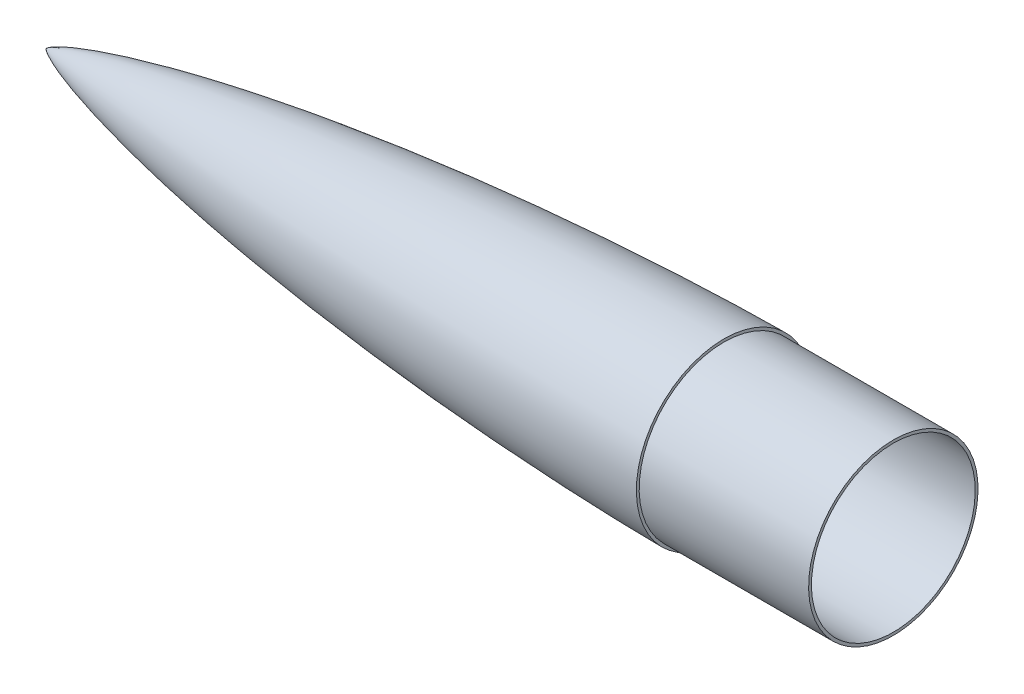
ISO-10303-21;
HEADER;
FILE_DESCRIPTION(('STEP AP214'),'2;1');
FILE_NAME('part.step','',(''),(''),'','','');
FILE_SCHEMA(('AUTOMOTIVE_DESIGN { 1 0 10303 214 1 1 1 1 }'));
ENDSEC;
DATA;
#1=APPLICATION_CONTEXT('core data for automotive mechanical design processes');
#2=APPLICATION_PROTOCOL_DEFINITION('international standard','automotive_design',2000,#1);
#3=PRODUCT_CONTEXT('',#1,'mechanical');
#4=PRODUCT('Part','Part','',(#3));
#5=PRODUCT_RELATED_PRODUCT_CATEGORY('part','',(#4));
#6=PRODUCT_DEFINITION_FORMATION('','',#4);
#7=PRODUCT_DEFINITION_CONTEXT('part definition',#1,'design');
#8=PRODUCT_DEFINITION('design','',#6,#7);
#9=PRODUCT_DEFINITION_SHAPE('','',#8);
#10=(LENGTH_UNIT() NAMED_UNIT(*) SI_UNIT(.MILLI.,.METRE.));
#11=(NAMED_UNIT(*) PLANE_ANGLE_UNIT() SI_UNIT($,.RADIAN.));
#12=(NAMED_UNIT(*) SI_UNIT($,.STERADIAN.) SOLID_ANGLE_UNIT());
#13=UNCERTAINTY_MEASURE_WITH_UNIT(LENGTH_MEASURE(1.E-05),#10,'distance_accuracy_value','');
#14=(GEOMETRIC_REPRESENTATION_CONTEXT(3) GLOBAL_UNCERTAINTY_ASSIGNED_CONTEXT((#13)) GLOBAL_UNIT_ASSIGNED_CONTEXT((#10,
#11,#12)) REPRESENTATION_CONTEXT('',''));
#15=CARTESIAN_POINT('',(0.,0.,0.));
#16=DIRECTION('',(0.,0.,1.));
#17=DIRECTION('',(1.,0.,0.));
#18=AXIS2_PLACEMENT_3D('',#15,#16,#17);
#19=CARTESIAN_POINT('',(600.,77.47,0.));
#20=CARTESIAN_POINT('',(597.65942685615,77.4658447079853,0.));
#21=CARTESIAN_POINT('',(592.978363359539,77.4343815130163,0.));
#22=CARTESIAN_POINT('',(583.616580802426,77.3332270163609,0.));
#23=CARTESIAN_POINT('',(569.49898193955,77.0956420813191,0.));
#24=CARTESIAN_POINT('',(552.966974814571,76.7206442390957,0.));
#25=CARTESIAN_POINT('',(529.266767625619,76.0339427982279,0.));
#26=CARTESIAN_POINT('',(500.742476414387,74.9827203862761,0.));
#27=CARTESIAN_POINT('',(467.476897077385,73.4429334180026,0.));
#28=CARTESIAN_POINT('',(429.481236677833,71.2563574350326,0.));
#29=CARTESIAN_POINT('',(391.513008679083,68.6356349821623,0.));
#30=CARTESIAN_POINT('',(353.578315332802,65.5666018523048,0.));
#31=CARTESIAN_POINT('',(315.684360024788,62.0288790639346,0.));
#32=CARTESIAN_POINT('',(277.839844478135,57.9951587186892,0.));
#33=CARTESIAN_POINT('',(240.055676063664,53.429010597853,0.));
#34=CARTESIAN_POINT('',(202.346019248344,48.2813417831547,0.));
#35=CARTESIAN_POINT('',(164.730421005852,42.4831314182115,0.));
#36=CARTESIAN_POINT('',(127.23756562155,35.932970079367,0.));
#37=CARTESIAN_POINT('',(92.1582043708413,28.9162848658495,0.));
#38=CARTESIAN_POINT('',(62.1009311464059,21.963904539052,0.));
#39=CARTESIAN_POINT('',(38.7361525078949,15.6535896542926,0.));
#40=CARTESIAN_POINT('',(23.0835174284881,10.7181703875056,0.));
#41=CARTESIAN_POINT('',(13.5227181713681,7.2185674366616,0.));
#42=CARTESIAN_POINT('',(7.85416793843196,4.81697869824112,0.));
#43=CARTESIAN_POINT('',(4.58865834047113,3.22196644659707,0.));
#44=CARTESIAN_POINT('',(2.74783568717532,2.19293433235411,0.));
#45=CARTESIAN_POINT('',(1.69521024540144,1.52603190181352,0.));
#46=CARTESIAN_POINT('',(1.1051925874636,1.10516765352529,0.));
#47=CARTESIAN_POINT('',(0.771381240188915,0.842123474085589,0.));
#48=CARTESIAN_POINT('',(0.567424397047217,0.667916865151608,0.));
#49=CARTESIAN_POINT('',(0.43490723908524,0.54786201784897,0.));
#50=CARTESIAN_POINT('',(0.31923409863706,0.43507249409992,0.));
#51=CARTESIAN_POINT('',(0.220339344368632,0.329970565301287,0.));
#52=CARTESIAN_POINT('',(0.138303003683084,0.233353669249751,0.));
#53=CARTESIAN_POINT('',(0.0807145741040968,0.157043573133438,0.));
#54=CARTESIAN_POINT('',(0.0401094622425092,0.0938383592977765,0.));
#55=CARTESIAN_POINT('',(0.0148611351607867,0.0453295476488326,0.));
#56=CARTESIAN_POINT('',(0.00482787870715673,0.0199168479065363,0.));
#57=CARTESIAN_POINT('',(0.00136820872431822,0.00671705417682318,0.));
#58=CARTESIAN_POINT('',(0.,0.,0.));
#59=B_SPLINE_CURVE_WITH_KNOTS('',4,(#19,#20,#21,#22,#23,#24,#25,#26,#27,#28,#29,#30,#31,#32,#33,
#34,#35,#36,#37,#38,#39,#40,#41,#42,#43,#44,#45,#46,#47,#48,#49,#50,#51,#52,#53,#54,#55,#56,#57,
#58),.UNSPECIFIED.,.F.,.F.,(5,1,1,1,1,1,1,1,1,1,1,1,1,1,1,1,1,1,1,1,1,1,1,1,1,1,1,1,1,1,1,1,1,1,
1,1,5),(0.,0.0153997937640812,0.0307995875281624,0.0615991750563248,0.0928992558619234,
0.124199336667522,0.186799498458059,0.249399660860594,0.311999822513962,0.37459998350091,
0.437200146859816,0.499800306621234,0.562400471363379,0.625000629652062,0.687600789677371,
0.750200949634411,0.812801112197428,0.87540126127302,0.9229481068622,0.953144474697247,
0.971996436080039,0.983353241385931,0.989910737043794,0.993632388483547,0.995896449383874,
0.997222203333055,0.998105498098468,0.998398642474987,0.998691786851506,0.998986789101797,
0.999281791352087,0.999461343514065,0.999640895676044,0.999820447838022,0.999910223919011,
0.999955111959505,1.),.UNSPECIFIED.);
#60=CARTESIAN_POINT('',(2700.,0.,0.));
#61=DIRECTION('',(1.,0.,0.));
#62=AXIS1_PLACEMENT('',#60,#61);
#63=SURFACE_OF_REVOLUTION('',#59,#62);
#64=CARTESIAN_POINT('',(0.,0.,0.));
#65=VERTEX_POINT('',#64);
#66=VERTEX_LOOP('',#65);
#67=FACE_BOUND('',#66,.T.);
#68=CARTESIAN_POINT('',(600.,0.,0.));
#69=DIRECTION('',(1.,0.,0.));
#70=DIRECTION('',(0.,1.,0.));
#71=AXIS2_PLACEMENT_3D('',#68,#69,#70);
#72=CIRCLE('',#71,77.47);
#73=CARTESIAN_POINT('',(600.,77.47,0.));
#74=VERTEX_POINT('',#73);
#75=EDGE_CURVE('E42',#74,#74,#72,.T.);
#76=ORIENTED_EDGE('',*,*,#75,.F.);
#77=EDGE_LOOP('',(#76));
#78=FACE_BOUND('',#77,.T.);
#79=ADVANCED_FACE('F35',(#67,#78),#63,.F.);
#80=CARTESIAN_POINT('',(600.,77.47,0.));
#81=DIRECTION('',(1.,0.,0.));
#82=DIRECTION('',(0.,1.,0.));
#83=AXIS2_PLACEMENT_3D('',#80,#81,#82);
#84=PLANE('',#83);
#85=CARTESIAN_POINT('',(600.,0.,0.));
#86=DIRECTION('',(1.,0.,0.));
#87=DIRECTION('',(0.,1.,0.));
#88=AXIS2_PLACEMENT_3D('',#85,#86,#87);
#89=CIRCLE('',#88,75.);
#90=CARTESIAN_POINT('',(600.,75.,0.));
#91=VERTEX_POINT('',#90);
#92=EDGE_CURVE('E53',#91,#91,#89,.T.);
#93=ORIENTED_EDGE('',*,*,#92,.F.);
#94=EDGE_LOOP('',(#93));
#95=FACE_BOUND('',#94,.T.);
#96=ORIENTED_EDGE('',*,*,#75,.T.);
#97=EDGE_LOOP('',(#96));
#98=FACE_BOUND('',#97,.T.);
#99=ADVANCED_FACE('F47',(#95,#98),#84,.T.);
#100=CARTESIAN_POINT('',(750.,0.,0.));
#101=DIRECTION('',(1.,0.,0.));
#102=DIRECTION('',(0.,1.,0.));
#103=AXIS2_PLACEMENT_3D('',#100,#101,#102);
#104=PLANE('',#103);
#105=CARTESIAN_POINT('',(750.,0.,0.));
#106=DIRECTION('',(1.,0.,0.));
#107=DIRECTION('',(0.,1.,0.));
#108=AXIS2_PLACEMENT_3D('',#105,#106,#107);
#109=CIRCLE('',#108,75.);
#110=CARTESIAN_POINT('',(750.,75.,0.));
#111=VERTEX_POINT('',#110);
#112=EDGE_CURVE('E51',#111,#111,#109,.T.);
#113=ORIENTED_EDGE('',*,*,#112,.T.);
#114=EDGE_LOOP('',(#113));
#115=FACE_BOUND('',#114,.T.);
#116=CARTESIAN_POINT('',(750.,0.,0.));
#117=DIRECTION('',(1.,0.,0.));
#118=DIRECTION('',(0.,1.,0.));
#119=AXIS2_PLACEMENT_3D('',#116,#117,#118);
#120=CIRCLE('',#119,72.5);
#121=CARTESIAN_POINT('',(750.,72.5,0.));
#122=VERTEX_POINT('',#121);
#123=EDGE_CURVE('E63',#122,#122,#120,.T.);
#124=ORIENTED_EDGE('',*,*,#123,.F.);
#125=EDGE_LOOP('',(#124));
#126=FACE_BOUND('',#125,.T.);
#127=ADVANCED_FACE('F71',(#115,#126),#104,.T.);
#128=CARTESIAN_POINT('',(750.,0.,0.));
#129=DIRECTION('',(-1.,0.,0.));
#130=DIRECTION('',(0.,-1.,0.));
#131=AXIS2_PLACEMENT_3D('',#128,#129,#130);
#132=CYLINDRICAL_SURFACE('',#131,75.);
#133=ORIENTED_EDGE('',*,*,#112,.F.);
#134=EDGE_LOOP('',(#133));
#135=FACE_BOUND('',#134,.T.);
#136=ORIENTED_EDGE('',*,*,#92,.T.);
#137=EDGE_LOOP('',(#136));
#138=FACE_BOUND('',#137,.T.);
#139=ADVANCED_FACE('F73',(#135,#138),#132,.T.);
#140=CARTESIAN_POINT('',(750.,0.,0.));
#141=DIRECTION('',(-1.,0.,0.));
#142=DIRECTION('',(0.,-1.,0.));
#143=AXIS2_PLACEMENT_3D('',#140,#141,#142);
#144=CYLINDRICAL_SURFACE('',#143,72.5);
#145=ORIENTED_EDGE('',*,*,#123,.T.);
#146=EDGE_LOOP('',(#145));
#147=FACE_BOUND('',#146,.T.);
#148=CARTESIAN_POINT('',(600.,0.,0.));
#149=DIRECTION('',(1.,0.,0.));
#150=DIRECTION('',(0.,1.,0.));
#151=AXIS2_PLACEMENT_3D('',#148,#149,#150);
#152=CIRCLE('',#151,72.5);
#153=CARTESIAN_POINT('',(600.,72.5,0.));
#154=VERTEX_POINT('',#153);
#155=EDGE_CURVE('E11',#154,#154,#152,.F.);
#156=ORIENTED_EDGE('',*,*,#155,.T.);
#157=EDGE_LOOP('',(#156));
#158=FACE_BOUND('',#157,.T.);
#159=ADVANCED_FACE('F68',(#147,#158),#144,.F.);
#160=ORIENTED_EDGE('',*,*,#155,.F.);
#161=EDGE_LOOP('',(#160));
#162=FACE_BOUND('',#161,.T.);
#163=ADVANCED_FACE('F83',(#162),#84,.T.);
#164=CLOSED_SHELL('',(#79,#99,#127,#139,#159,#163));
#165=MANIFOLD_SOLID_BREP('B2',#164);
#166=ADVANCED_BREP_SHAPE_REPRESENTATION('',(#18,#165),#14);
#167=SHAPE_DEFINITION_REPRESENTATION(#9,#166);
ENDSEC;
END-ISO-10303-21;
